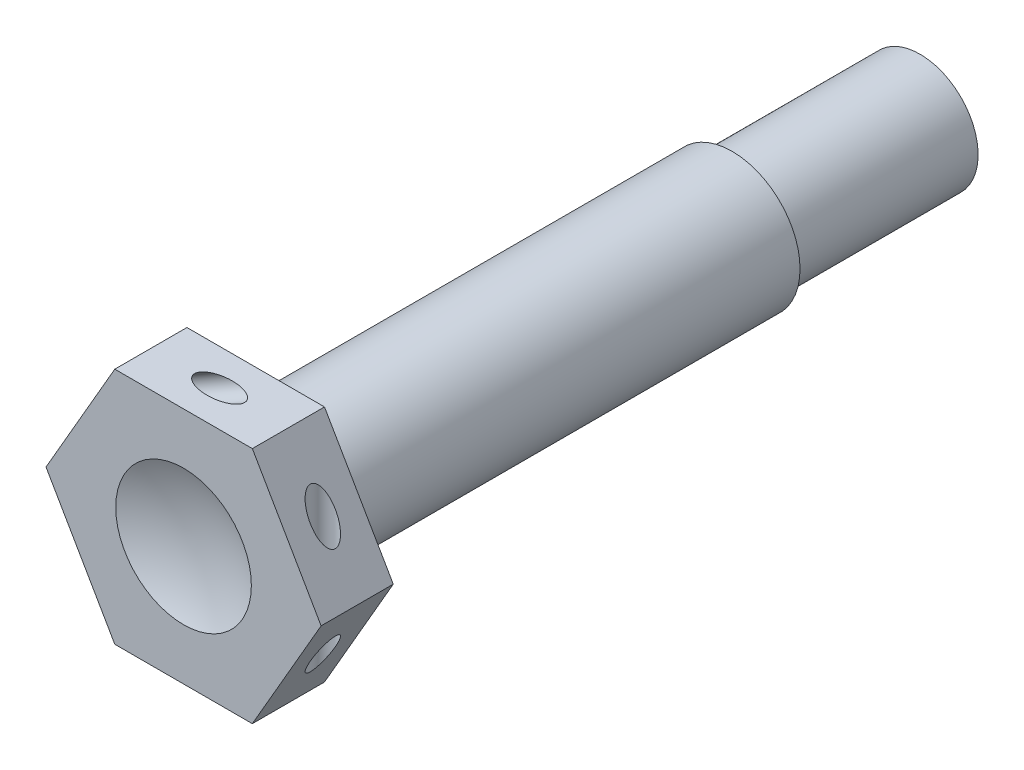
ISO-10303-21;
HEADER;
FILE_DESCRIPTION(('STEP AP214'),'2;1');
FILE_NAME('part.step','',(''),(''),'','','');
FILE_SCHEMA(('AUTOMOTIVE_DESIGN { 1 0 10303 214 1 1 1 1 }'));
ENDSEC;
DATA;
#1=APPLICATION_CONTEXT('core data for automotive mechanical design processes');
#2=APPLICATION_PROTOCOL_DEFINITION('international standard','automotive_design',2000,#1);
#3=PRODUCT_CONTEXT('',#1,'mechanical');
#4=PRODUCT('Part','Part','',(#3));
#5=PRODUCT_RELATED_PRODUCT_CATEGORY('part','',(#4));
#6=PRODUCT_DEFINITION_FORMATION('','',#4);
#7=PRODUCT_DEFINITION_CONTEXT('part definition',#1,'design');
#8=PRODUCT_DEFINITION('design','',#6,#7);
#9=PRODUCT_DEFINITION_SHAPE('','',#8);
#10=(LENGTH_UNIT() NAMED_UNIT(*) SI_UNIT(.MILLI.,.METRE.));
#11=(NAMED_UNIT(*) PLANE_ANGLE_UNIT() SI_UNIT($,.RADIAN.));
#12=(NAMED_UNIT(*) SI_UNIT($,.STERADIAN.) SOLID_ANGLE_UNIT());
#13=UNCERTAINTY_MEASURE_WITH_UNIT(LENGTH_MEASURE(1.E-05),#10,'distance_accuracy_value','');
#14=(GEOMETRIC_REPRESENTATION_CONTEXT(3) GLOBAL_UNCERTAINTY_ASSIGNED_CONTEXT((#13)) GLOBAL_UNIT_ASSIGNED_CONTEXT((#10,
#11,#12)) REPRESENTATION_CONTEXT('',''));
#15=CARTESIAN_POINT('',(0.,0.,0.));
#16=DIRECTION('',(0.,0.,1.));
#17=DIRECTION('',(1.,0.,0.));
#18=AXIS2_PLACEMENT_3D('',#15,#16,#17);
#19=CARTESIAN_POINT('',(6.41580486636972,0.,3.3655));
#20=DIRECTION('',(-0.866025403784438,-0.5,0.));
#21=DIRECTION('',(0.5,-0.866025403784439,0.));
#22=AXIS2_PLACEMENT_3D('',#19,#20,#21);
#23=PLANE('',#22);
#24=CARTESIAN_POINT('',(4.81185364977729,2.778125,1.68275));
#25=DIRECTION('',(-0.866025403784438,-0.5,0.));
#26=DIRECTION('',(-0.5,0.866025403784439,0.));
#27=AXIS2_PLACEMENT_3D('',#24,#25,#26);
#28=ELLIPSE('',#27,1.1684,0.5842);
#29=CARTESIAN_POINT('',(4.22765364977729,3.78998908178174,1.68275));
#30=VERTEX_POINT('',#29);
#31=EDGE_CURVE('E142',#30,#30,#28,.T.);
#32=ORIENTED_EDGE('',*,*,#31,.T.);
#33=EDGE_LOOP('',(#32));
#34=FACE_BOUND('',#33,.T.);
#35=DIRECTION('',(-0.5,0.866025403784438,0.));
#36=VECTOR('',#35,1.);
#37=CARTESIAN_POINT('',(6.41580486636972,0.,0.));
#38=LINE('',#37,#36);
#39=CARTESIAN_POINT('',(6.41580486636972,0.,0.));
#40=VERTEX_POINT('',#39);
#41=CARTESIAN_POINT('',(3.20790243318486,5.55625,0.));
#42=VERTEX_POINT('',#41);
#43=EDGE_CURVE('E121',#40,#42,#38,.T.);
#44=ORIENTED_EDGE('',*,*,#43,.T.);
#45=DIRECTION('',(0.,0.,-1.));
#46=VECTOR('',#45,1.);
#47=CARTESIAN_POINT('',(3.20790243318486,5.55625,3.3655));
#48=LINE('',#47,#46);
#49=CARTESIAN_POINT('',(3.20790243318486,5.55625,3.3655));
#50=VERTEX_POINT('',#49);
#51=EDGE_CURVE('E43',#50,#42,#48,.T.);
#52=ORIENTED_EDGE('',*,*,#51,.F.);
#53=DIRECTION('',(-0.5,0.866025403784438,0.));
#54=VECTOR('',#53,1.);
#55=CARTESIAN_POINT('',(6.41580486636972,0.,3.3655));
#56=LINE('',#55,#54);
#57=CARTESIAN_POINT('',(6.41580486636972,0.,3.3655));
#58=VERTEX_POINT('',#57);
#59=EDGE_CURVE('E132',#58,#50,#56,.T.);
#60=ORIENTED_EDGE('',*,*,#59,.F.);
#61=DIRECTION('',(0.,0.,-1.));
#62=VECTOR('',#61,1.);
#63=CARTESIAN_POINT('',(6.41580486636972,0.,3.3655));
#64=LINE('',#63,#62);
#65=EDGE_CURVE('E117',#58,#40,#64,.T.);
#66=ORIENTED_EDGE('',*,*,#65,.T.);
#67=EDGE_LOOP('',(#44,#52,#60,#66));
#68=FACE_BOUND('',#67,.T.);
#69=ADVANCED_FACE('F34',(#34,#68),#23,.F.);
#70=CARTESIAN_POINT('',(3.20790243318486,5.55625,3.3655));
#71=DIRECTION('',(0.,-1.,0.));
#72=DIRECTION('',(0.,0.,-1.));
#73=AXIS2_PLACEMENT_3D('',#70,#71,#72);
#74=PLANE('',#73);
#75=CARTESIAN_POINT('',(0.,5.55625,1.68275));
#76=DIRECTION('',(0.,-1.,0.));
#77=DIRECTION('',(-1.,0.,0.));
#78=AXIS2_PLACEMENT_3D('',#75,#76,#77);
#79=ELLIPSE('',#78,1.16839999999999,0.5842);
#80=CARTESIAN_POINT('',(-1.16840000000001,5.55625,1.68275));
#81=VERTEX_POINT('',#80);
#82=EDGE_CURVE('E143',#81,#81,#79,.T.);
#83=ORIENTED_EDGE('',*,*,#82,.T.);
#84=EDGE_LOOP('',(#83));
#85=FACE_BOUND('',#84,.T.);
#86=DIRECTION('',(-1.,0.,0.));
#87=VECTOR('',#86,1.);
#88=CARTESIAN_POINT('',(3.20790243318486,5.55625,0.));
#89=LINE('',#88,#87);
#90=CARTESIAN_POINT('',(-3.20790243318486,5.55625,0.));
#91=VERTEX_POINT('',#90);
#92=EDGE_CURVE('E124',#42,#91,#89,.T.);
#93=ORIENTED_EDGE('',*,*,#92,.T.);
#94=DIRECTION('',(0.,0.,-1.));
#95=VECTOR('',#94,1.);
#96=CARTESIAN_POINT('',(-3.20790243318486,5.55625,3.3655));
#97=LINE('',#96,#95);
#98=CARTESIAN_POINT('',(-3.20790243318486,5.55625,3.3655));
#99=VERTEX_POINT('',#98);
#100=EDGE_CURVE('E136',#99,#91,#97,.T.);
#101=ORIENTED_EDGE('',*,*,#100,.F.);
#102=DIRECTION('',(-1.,0.,0.));
#103=VECTOR('',#102,1.);
#104=CARTESIAN_POINT('',(3.20790243318486,5.55625,3.3655));
#105=LINE('',#104,#103);
#106=EDGE_CURVE('E90',#50,#99,#105,.T.);
#107=ORIENTED_EDGE('',*,*,#106,.F.);
#108=ORIENTED_EDGE('',*,*,#51,.T.);
#109=EDGE_LOOP('',(#93,#101,#107,#108));
#110=FACE_BOUND('',#109,.T.);
#111=ADVANCED_FACE('F173',(#85,#110),#74,.F.);
#112=CARTESIAN_POINT('',(-3.20790243318486,5.55625,3.3655));
#113=DIRECTION('',(0.866025403784439,-0.499999999999999,0.));
#114=DIRECTION('',(0.499999999999999,0.866025403784439,0.));
#115=AXIS2_PLACEMENT_3D('',#112,#113,#114);
#116=PLANE('',#115);
#117=CARTESIAN_POINT('',(-4.8118536497773,2.77812499999997,1.68275));
#118=DIRECTION('',(0.866025403784439,-0.499999999999999,0.));
#119=DIRECTION('',(-0.499999999999999,-0.866025403784439,0.));
#120=AXIS2_PLACEMENT_3D('',#117,#118,#119);
#121=ELLIPSE('',#120,1.16840000000001,0.5842);
#122=CARTESIAN_POINT('',(-5.39605364977731,1.76626091821823,1.68275));
#123=VERTEX_POINT('',#122);
#124=EDGE_CURVE('E37',#123,#123,#121,.T.);
#125=ORIENTED_EDGE('',*,*,#124,.T.);
#126=EDGE_LOOP('',(#125));
#127=FACE_BOUND('',#126,.T.);
#128=DIRECTION('',(-0.499999999999999,-0.866025403784439,0.));
#129=VECTOR('',#128,1.);
#130=CARTESIAN_POINT('',(-3.20790243318486,5.55625,0.));
#131=LINE('',#130,#129);
#132=CARTESIAN_POINT('',(-6.41580486636972,0.,0.));
#133=VERTEX_POINT('',#132);
#134=EDGE_CURVE('E127',#91,#133,#131,.T.);
#135=ORIENTED_EDGE('',*,*,#134,.T.);
#136=DIRECTION('',(0.,0.,-1.));
#137=VECTOR('',#136,1.);
#138=CARTESIAN_POINT('',(-6.41580486636972,0.,3.3655));
#139=LINE('',#138,#137);
#140=CARTESIAN_POINT('',(-6.41580486636972,0.,3.3655));
#141=VERTEX_POINT('',#140);
#142=EDGE_CURVE('E112',#141,#133,#139,.T.);
#143=ORIENTED_EDGE('',*,*,#142,.F.);
#144=DIRECTION('',(-0.499999999999999,-0.866025403784439,0.));
#145=VECTOR('',#144,1.);
#146=CARTESIAN_POINT('',(-3.20790243318486,5.55625,3.3655));
#147=LINE('',#146,#145);
#148=EDGE_CURVE('E103',#99,#141,#147,.T.);
#149=ORIENTED_EDGE('',*,*,#148,.F.);
#150=ORIENTED_EDGE('',*,*,#100,.T.);
#151=EDGE_LOOP('',(#135,#143,#149,#150));
#152=FACE_BOUND('',#151,.T.);
#153=ADVANCED_FACE('F176',(#127,#152),#116,.F.);
#154=CARTESIAN_POINT('',(-6.41580486636972,0.,3.3655));
#155=DIRECTION('',(0.866025403784438,0.5,0.));
#156=DIRECTION('',(-0.5,0.866025403784438,0.));
#157=AXIS2_PLACEMENT_3D('',#154,#155,#156);
#158=PLANE('',#157);
#159=CARTESIAN_POINT('',(-4.81185364977726,-2.77812500000004,1.68275));
#160=DIRECTION('',(0.866025403784438,0.5,0.));
#161=DIRECTION('',(0.5,-0.866025403784438,0.));
#162=AXIS2_PLACEMENT_3D('',#159,#160,#161);
#163=ELLIPSE('',#162,1.16839999999998,0.5842);
#164=CARTESIAN_POINT('',(-4.22765364977727,-3.78998908178176,1.68275));
#165=VERTEX_POINT('',#164);
#166=EDGE_CURVE('E146',#165,#165,#163,.T.);
#167=ORIENTED_EDGE('',*,*,#166,.T.);
#168=EDGE_LOOP('',(#167));
#169=FACE_BOUND('',#168,.T.);
#170=DIRECTION('',(0.5,-0.866025403784438,0.));
#171=VECTOR('',#170,1.);
#172=CARTESIAN_POINT('',(-6.41580486636972,0.,0.));
#173=LINE('',#172,#171);
#174=CARTESIAN_POINT('',(-3.20790243318486,-5.55625,0.));
#175=VERTEX_POINT('',#174);
#176=EDGE_CURVE('E111',#133,#175,#173,.T.);
#177=ORIENTED_EDGE('',*,*,#176,.T.);
#178=DIRECTION('',(0.,0.,-1.));
#179=VECTOR('',#178,1.);
#180=CARTESIAN_POINT('',(-3.20790243318486,-5.55625,3.3655));
#181=LINE('',#180,#179);
#182=CARTESIAN_POINT('',(-3.20790243318486,-5.55625,3.3655));
#183=VERTEX_POINT('',#182);
#184=EDGE_CURVE('E108',#183,#175,#181,.T.);
#185=ORIENTED_EDGE('',*,*,#184,.F.);
#186=DIRECTION('',(0.5,-0.866025403784438,0.));
#187=VECTOR('',#186,1.);
#188=CARTESIAN_POINT('',(-6.41580486636972,0.,3.3655));
#189=LINE('',#188,#187);
#190=EDGE_CURVE('E97',#141,#183,#189,.T.);
#191=ORIENTED_EDGE('',*,*,#190,.F.);
#192=ORIENTED_EDGE('',*,*,#142,.T.);
#193=EDGE_LOOP('',(#177,#185,#191,#192));
#194=FACE_BOUND('',#193,.T.);
#195=ADVANCED_FACE('F109',(#169,#194),#158,.F.);
#196=CARTESIAN_POINT('',(-3.20790243318486,-5.55625,3.3655));
#197=DIRECTION('',(0.,1.,0.));
#198=DIRECTION('',(-1.,0.,0.));
#199=AXIS2_PLACEMENT_3D('',#196,#197,#198);
#200=PLANE('',#199);
#201=CARTESIAN_POINT('',(0.,-5.55625,1.68275));
#202=DIRECTION('',(0.,1.,0.));
#203=DIRECTION('',(1.,0.,0.));
#204=AXIS2_PLACEMENT_3D('',#201,#202,#203);
#205=ELLIPSE('',#204,1.16840000000002,0.5842);
#206=CARTESIAN_POINT('',(1.16840000000008,-5.55625,1.68275));
#207=VERTEX_POINT('',#206);
#208=EDGE_CURVE('E144',#207,#207,#205,.T.);
#209=ORIENTED_EDGE('',*,*,#208,.T.);
#210=EDGE_LOOP('',(#209));
#211=FACE_BOUND('',#210,.T.);
#212=DIRECTION('',(1.,0.,0.));
#213=VECTOR('',#212,1.);
#214=CARTESIAN_POINT('',(-3.20790243318486,-5.55625,0.));
#215=LINE('',#214,#213);
#216=CARTESIAN_POINT('',(3.20790243318486,-5.55625,0.));
#217=VERTEX_POINT('',#216);
#218=EDGE_CURVE('E75',#175,#217,#215,.T.);
#219=ORIENTED_EDGE('',*,*,#218,.T.);
#220=DIRECTION('',(0.,0.,-1.));
#221=VECTOR('',#220,1.);
#222=CARTESIAN_POINT('',(3.20790243318486,-5.55625,3.3655));
#223=LINE('',#222,#221);
#224=CARTESIAN_POINT('',(3.20790243318486,-5.55625,3.3655));
#225=VERTEX_POINT('',#224);
#226=EDGE_CURVE('E113',#225,#217,#223,.T.);
#227=ORIENTED_EDGE('',*,*,#226,.F.);
#228=DIRECTION('',(1.,0.,0.));
#229=VECTOR('',#228,1.);
#230=CARTESIAN_POINT('',(-3.20790243318486,-5.55625,3.3655));
#231=LINE('',#230,#229);
#232=EDGE_CURVE('E101',#183,#225,#231,.T.);
#233=ORIENTED_EDGE('',*,*,#232,.F.);
#234=ORIENTED_EDGE('',*,*,#184,.T.);
#235=EDGE_LOOP('',(#219,#227,#233,#234));
#236=FACE_BOUND('',#235,.T.);
#237=ADVANCED_FACE('F115',(#211,#236),#200,.F.);
#238=CARTESIAN_POINT('',(3.20790243318486,-5.55625,3.3655));
#239=DIRECTION('',(-0.866025403784439,0.5,0.));
#240=DIRECTION('',(-0.5,-0.866025403784439,0.));
#241=AXIS2_PLACEMENT_3D('',#238,#239,#240);
#242=PLANE('',#241);
#243=CARTESIAN_POINT('',(4.81185364977729,-2.778125,1.68275));
#244=DIRECTION('',(-0.866025403784439,0.5,0.));
#245=DIRECTION('',(0.5,0.866025403784439,0.));
#246=AXIS2_PLACEMENT_3D('',#243,#244,#245);
#247=ELLIPSE('',#246,1.1684,0.5842);
#248=CARTESIAN_POINT('',(5.39605364977729,-1.76626091821826,1.68275));
#249=VERTEX_POINT('',#248);
#250=EDGE_CURVE('E140',#249,#249,#247,.T.);
#251=ORIENTED_EDGE('',*,*,#250,.T.);
#252=EDGE_LOOP('',(#251));
#253=FACE_BOUND('',#252,.T.);
#254=DIRECTION('',(0.5,0.866025403784439,0.));
#255=VECTOR('',#254,1.);
#256=CARTESIAN_POINT('',(3.20790243318486,-5.55625,0.));
#257=LINE('',#256,#255);
#258=EDGE_CURVE('E81',#217,#40,#257,.T.);
#259=ORIENTED_EDGE('',*,*,#258,.T.);
#260=ORIENTED_EDGE('',*,*,#65,.F.);
#261=DIRECTION('',(0.5,0.866025403784439,0.));
#262=VECTOR('',#261,1.);
#263=CARTESIAN_POINT('',(3.20790243318486,-5.55625,3.3655));
#264=LINE('',#263,#262);
#265=EDGE_CURVE('E52',#225,#58,#264,.T.);
#266=ORIENTED_EDGE('',*,*,#265,.F.);
#267=ORIENTED_EDGE('',*,*,#226,.T.);
#268=EDGE_LOOP('',(#259,#260,#266,#267));
#269=FACE_BOUND('',#268,.T.);
#270=ADVANCED_FACE('F181',(#253,#269),#242,.F.);
#271=CARTESIAN_POINT('',(0.,0.,3.3655));
#272=DIRECTION('',(0.,0.,1.));
#273=DIRECTION('',(1.,0.,0.));
#274=AXIS2_PLACEMENT_3D('',#271,#272,#273);
#275=PLANE('',#274);
#276=CARTESIAN_POINT('',(0.,0.,3.3655));
#277=DIRECTION('',(0.,0.,1.));
#278=DIRECTION('',(0.,-1.,0.));
#279=AXIS2_PLACEMENT_3D('',#276,#277,#278);
#280=CIRCLE('',#279,3.1623);
#281=CARTESIAN_POINT('',(0.,-3.1623,3.3655));
#282=VERTEX_POINT('',#281);
#283=EDGE_CURVE('E159',#282,#282,#280,.T.);
#284=ORIENTED_EDGE('',*,*,#283,.F.);
#285=EDGE_LOOP('',(#284));
#286=FACE_BOUND('',#285,.T.);
#287=ORIENTED_EDGE('',*,*,#59,.T.);
#288=ORIENTED_EDGE('',*,*,#106,.T.);
#289=ORIENTED_EDGE('',*,*,#148,.T.);
#290=ORIENTED_EDGE('',*,*,#190,.T.);
#291=ORIENTED_EDGE('',*,*,#232,.T.);
#292=ORIENTED_EDGE('',*,*,#265,.T.);
#293=EDGE_LOOP('',(#287,#288,#289,#290,#291,#292));
#294=FACE_BOUND('',#293,.T.);
#295=ADVANCED_FACE('F99',(#286,#294),#275,.T.);
#296=CARTESIAN_POINT('',(0.,0.,0.));
#297=DIRECTION('',(0.,0.,1.));
#298=DIRECTION('',(1.,0.,0.));
#299=AXIS2_PLACEMENT_3D('',#296,#297,#298);
#300=PLANE('',#299);
#301=CARTESIAN_POINT('',(0.,0.,0.));
#302=DIRECTION('',(0.,0.,1.));
#303=DIRECTION('',(1.,0.,0.));
#304=AXIS2_PLACEMENT_3D('',#301,#302,#303);
#305=CIRCLE('',#304,3.1623);
#306=CARTESIAN_POINT('',(3.1623,0.,0.));
#307=VERTEX_POINT('',#306);
#308=EDGE_CURVE('E11',#307,#307,#305,.F.);
#309=ORIENTED_EDGE('',*,*,#308,.F.);
#310=EDGE_LOOP('',(#309));
#311=FACE_BOUND('',#310,.T.);
#312=ORIENTED_EDGE('',*,*,#43,.F.);
#313=ORIENTED_EDGE('',*,*,#258,.F.);
#314=ORIENTED_EDGE('',*,*,#218,.F.);
#315=ORIENTED_EDGE('',*,*,#176,.F.);
#316=ORIENTED_EDGE('',*,*,#134,.F.);
#317=ORIENTED_EDGE('',*,*,#92,.F.);
#318=EDGE_LOOP('',(#312,#313,#314,#315,#316,#317));
#319=FACE_BOUND('',#318,.T.);
#320=ADVANCED_FACE('F179',(#311,#319),#300,.F.);
#321=CARTESIAN_POINT('',(0.,0.,-22.225));
#322=DIRECTION('',(0.,0.,1.));
#323=DIRECTION('',(1.,0.,0.));
#324=AXIS2_PLACEMENT_3D('',#321,#322,#323);
#325=CYLINDRICAL_SURFACE('',#324,3.1623);
#326=CARTESIAN_POINT('',(0.,0.,-22.225));
#327=DIRECTION('',(0.,0.,-1.));
#328=DIRECTION('',(-1.,0.,0.));
#329=AXIS2_PLACEMENT_3D('',#326,#327,#328);
#330=CIRCLE('',#329,3.1623);
#331=CARTESIAN_POINT('',(-3.1623,0.,-22.225));
#332=VERTEX_POINT('',#331);
#333=EDGE_CURVE('E125',#332,#332,#330,.T.);
#334=ORIENTED_EDGE('',*,*,#333,.F.);
#335=EDGE_LOOP('',(#334));
#336=FACE_BOUND('',#335,.T.);
#337=ORIENTED_EDGE('',*,*,#308,.T.);
#338=EDGE_LOOP('',(#337));
#339=FACE_BOUND('',#338,.T.);
#340=ADVANCED_FACE('F230',(#336,#339),#325,.T.);
#341=CARTESIAN_POINT('',(0.,0.,-22.225));
#342=DIRECTION('',(0.,0.,-1.));
#343=DIRECTION('',(-1.,0.,0.));
#344=AXIS2_PLACEMENT_3D('',#341,#342,#343);
#345=PLANE('',#344);
#346=CARTESIAN_POINT('',(0.,0.,-22.225));
#347=DIRECTION('',(0.,0.,-1.));
#348=DIRECTION('',(-1.,0.,0.));
#349=AXIS2_PLACEMENT_3D('',#346,#347,#348);
#350=CIRCLE('',#349,2.7051);
#351=CARTESIAN_POINT('',(-2.7051,0.,-22.225));
#352=VERTEX_POINT('',#351);
#353=EDGE_CURVE('E162',#352,#352,#350,.T.);
#354=ORIENTED_EDGE('',*,*,#353,.F.);
#355=EDGE_LOOP('',(#354));
#356=FACE_BOUND('',#355,.T.);
#357=ORIENTED_EDGE('',*,*,#333,.T.);
#358=EDGE_LOOP('',(#357));
#359=FACE_BOUND('',#358,.T.);
#360=ADVANCED_FACE('F226',(#356,#359),#345,.T.);
#361=CARTESIAN_POINT('',(0.,0.,-30.988));
#362=DIRECTION('',(0.,0.,1.));
#363=DIRECTION('',(1.,0.,0.));
#364=AXIS2_PLACEMENT_3D('',#361,#362,#363);
#365=CYLINDRICAL_SURFACE('',#364,2.7051);
#366=CARTESIAN_POINT('',(0.,0.,-30.988));
#367=DIRECTION('',(0.,0.,-1.));
#368=DIRECTION('',(-1.,0.,0.));
#369=AXIS2_PLACEMENT_3D('',#366,#367,#368);
#370=CIRCLE('',#369,2.7051);
#371=CARTESIAN_POINT('',(-2.7051,0.,-30.988));
#372=VERTEX_POINT('',#371);
#373=EDGE_CURVE('E163',#372,#372,#370,.T.);
#374=ORIENTED_EDGE('',*,*,#373,.F.);
#375=EDGE_LOOP('',(#374));
#376=FACE_BOUND('',#375,.T.);
#377=ORIENTED_EDGE('',*,*,#353,.T.);
#378=EDGE_LOOP('',(#377));
#379=FACE_BOUND('',#378,.T.);
#380=ADVANCED_FACE('F222',(#376,#379),#365,.T.);
#381=CARTESIAN_POINT('',(0.,0.,-30.988));
#382=DIRECTION('',(0.,0.,-1.));
#383=DIRECTION('',(-1.,0.,0.));
#384=AXIS2_PLACEMENT_3D('',#381,#382,#383);
#385=PLANE('',#384);
#386=ORIENTED_EDGE('',*,*,#373,.T.);
#387=EDGE_LOOP('',(#386));
#388=FACE_BOUND('',#387,.T.);
#389=ADVANCED_FACE('F214',(#388),#385,.T.);
#390=CARTESIAN_POINT('',(0.,0.,10.1470742347274));
#391=DIRECTION('',(0.,0.,1.));
#392=DIRECTION('',(0.,1.,0.));
#393=AXIS2_PLACEMENT_3D('',#390,#391,#392);
#394=SPHERICAL_SURFACE('',#393,7.48263926640312);
#395=ORIENTED_EDGE('',*,*,#283,.T.);
#396=EDGE_LOOP('',(#395));
#397=FACE_BOUND('',#396,.T.);
#398=ADVANCED_FACE('F204',(#397),#394,.F.);
#399=CARTESIAN_POINT('',(4.81185364977729,-5.55625,1.68275));
#400=DIRECTION('',(0.,1.,0.));
#401=DIRECTION('',(0.,0.,1.));
#402=AXIS2_PLACEMENT_3D('',#399,#400,#401);
#403=CYLINDRICAL_SURFACE('',#402,0.5842);
#404=ORIENTED_EDGE('',*,*,#250,.F.);
#405=EDGE_LOOP('',(#404));
#406=FACE_BOUND('',#405,.T.);
#407=ORIENTED_EDGE('',*,*,#31,.F.);
#408=EDGE_LOOP('',(#407));
#409=FACE_BOUND('',#408,.T.);
#410=ADVANCED_FACE('F201',(#406,#409),#403,.F.);
#411=CARTESIAN_POINT('',(-9.62370729955456,0.,1.68275));
#412=DIRECTION('',(0.866025403784443,-0.499999999999992,0.));
#413=DIRECTION('',(0.499999999999992,0.866025403784443,0.));
#414=AXIS2_PLACEMENT_3D('',#411,#412,#413);
#415=CYLINDRICAL_SURFACE('',#414,0.5842);
#416=ORIENTED_EDGE('',*,*,#208,.F.);
#417=EDGE_LOOP('',(#416));
#418=FACE_BOUND('',#417,.T.);
#419=ORIENTED_EDGE('',*,*,#166,.F.);
#420=EDGE_LOOP('',(#419));
#421=FACE_BOUND('',#420,.T.);
#422=ADVANCED_FACE('F203',(#418,#421),#415,.F.);
#423=CARTESIAN_POINT('',(4.81185364977725,8.33437500000002,1.68275));
#424=DIRECTION('',(-0.866025403784436,-0.500000000000004,0.));
#425=DIRECTION('',(0.500000000000004,-0.866025403784436,0.));
#426=AXIS2_PLACEMENT_3D('',#423,#424,#425);
#427=CYLINDRICAL_SURFACE('',#426,0.5842);
#428=ORIENTED_EDGE('',*,*,#124,.F.);
#429=EDGE_LOOP('',(#428));
#430=FACE_BOUND('',#429,.T.);
#431=ORIENTED_EDGE('',*,*,#82,.F.);
#432=EDGE_LOOP('',(#431));
#433=FACE_BOUND('',#432,.T.);
#434=ADVANCED_FACE('F211',(#430,#433),#427,.F.);
#435=CLOSED_SHELL('',(#69,#111,#153,#195,#237,#270,#295,#320,#340,#360,#380,#389,#398,#410,#422,#434));
#436=MANIFOLD_SOLID_BREP('B2',#435);
#437=ADVANCED_BREP_SHAPE_REPRESENTATION('',(#18,#436),#14);
#438=SHAPE_DEFINITION_REPRESENTATION(#9,#437);
ENDSEC;
END-ISO-10303-21;
